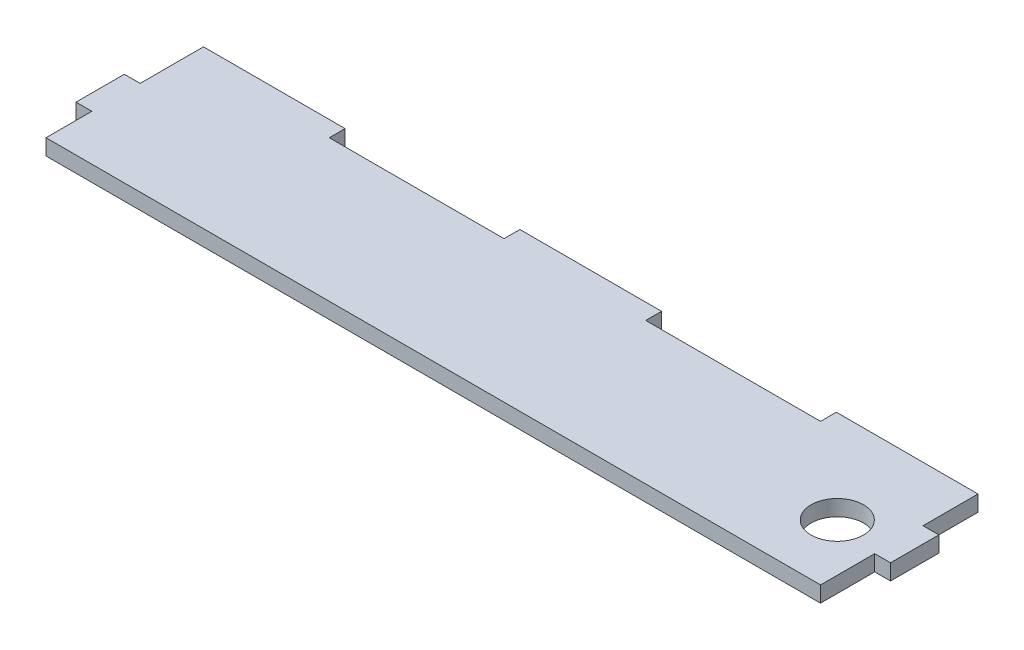
ISO-10303-21;
HEADER;
FILE_DESCRIPTION(('STEP AP214'),'2;1');
FILE_NAME('part.step','',(''),(''),'','','');
FILE_SCHEMA(('AUTOMOTIVE_DESIGN { 1 0 10303 214 1 1 1 1 }'));
ENDSEC;
DATA;
#1=APPLICATION_CONTEXT('core data for automotive mechanical design processes');
#2=APPLICATION_PROTOCOL_DEFINITION('international standard','automotive_design',2000,#1);
#3=PRODUCT_CONTEXT('',#1,'mechanical');
#4=PRODUCT('Part','Part','',(#3));
#5=PRODUCT_RELATED_PRODUCT_CATEGORY('part','',(#4));
#6=PRODUCT_DEFINITION_FORMATION('','',#4);
#7=PRODUCT_DEFINITION_CONTEXT('part definition',#1,'design');
#8=PRODUCT_DEFINITION('design','',#6,#7);
#9=PRODUCT_DEFINITION_SHAPE('','',#8);
#10=(LENGTH_UNIT() NAMED_UNIT(*) SI_UNIT(.MILLI.,.METRE.));
#11=(NAMED_UNIT(*) PLANE_ANGLE_UNIT() SI_UNIT($,.RADIAN.));
#12=(NAMED_UNIT(*) SI_UNIT($,.STERADIAN.) SOLID_ANGLE_UNIT());
#13=UNCERTAINTY_MEASURE_WITH_UNIT(LENGTH_MEASURE(1.E-05),#10,'distance_accuracy_value','');
#14=(GEOMETRIC_REPRESENTATION_CONTEXT(3) GLOBAL_UNCERTAINTY_ASSIGNED_CONTEXT((#13)) GLOBAL_UNIT_ASSIGNED_CONTEXT((#10,
#11,#12)) REPRESENTATION_CONTEXT('',''));
#15=CARTESIAN_POINT('',(0.,0.,0.));
#16=DIRECTION('',(0.,0.,1.));
#17=DIRECTION('',(1.,0.,0.));
#18=AXIS2_PLACEMENT_3D('',#15,#16,#17);
#19=CARTESIAN_POINT('',(-948.418408841076,3374.03154429096,189.));
#20=DIRECTION('',(-1.,0.,0.));
#21=DIRECTION('',(0.,-1.,0.));
#22=AXIS2_PLACEMENT_3D('',#19,#20,#21);
#23=PLANE('',#22);
#24=CARTESIAN_POINT('',(-948.418408841076,3355.03154429096,66.));
#25=CARTESIAN_POINT('',(-948.418408841076,3374.03154429096,66.));
#26=B_SPLINE_CURVE_WITH_KNOTS('',1,(#24,#25),.UNSPECIFIED.,.F.,.F.,(2,2),(0.,0.123376623376624),.UNSPECIFIED.);
#27=CARTESIAN_POINT('',(-948.418408841076,3355.03154429096,66.));
#28=VERTEX_POINT('',#27);
#29=CARTESIAN_POINT('',(-948.418408841076,3374.03154429096,66.));
#30=VERTEX_POINT('',#29);
#31=EDGE_CURVE('E189',#28,#30,#26,.T.);
#32=ORIENTED_EDGE('',*,*,#31,.F.);
#33=DIRECTION('',(0.,0.,-1.));
#34=VECTOR('',#33,1.);
#35=CARTESIAN_POINT('',(-948.418408841076,3355.03154429096,189.));
#36=LINE('',#35,#34);
#37=CARTESIAN_POINT('',(-948.418408841076,3355.03154429096,0.));
#38=VERTEX_POINT('',#37);
#39=EDGE_CURVE('E174',#28,#38,#36,.T.);
#40=ORIENTED_EDGE('',*,*,#39,.T.);
#41=DIRECTION('',(0.,-1.,0.));
#42=VECTOR('',#41,1.);
#43=CARTESIAN_POINT('',(-948.418408841076,3374.03154429096,0.));
#44=LINE('',#43,#42);
#45=CARTESIAN_POINT('',(-948.418408841076,3374.03154429096,0.));
#46=VERTEX_POINT('',#45);
#47=EDGE_CURVE('E217',#46,#38,#44,.T.);
#48=ORIENTED_EDGE('',*,*,#47,.F.);
#49=DIRECTION('',(0.,0.,-1.));
#50=VECTOR('',#49,1.);
#51=CARTESIAN_POINT('',(-948.418408841076,3374.03154429096,189.));
#52=LINE('',#51,#50);
#53=EDGE_CURVE('E47',#30,#46,#52,.T.);
#54=ORIENTED_EDGE('',*,*,#53,.F.);
#55=EDGE_LOOP('',(#32,#40,#48,#54));
#56=FACE_BOUND('',#55,.T.);
#57=ADVANCED_FACE('F32',(#56),#23,.F.);
#58=CARTESIAN_POINT('',(-948.418408841076,3374.03154429096,124.));
#59=CARTESIAN_POINT('',(-948.418408841076,3355.03154429096,124.));
#60=B_SPLINE_CURVE_WITH_KNOTS('',1,(#58,#59),.UNSPECIFIED.,.F.,.F.,(2,2),(0.5,
0.623376623376624),.UNSPECIFIED.);
#61=CARTESIAN_POINT('',(-948.418408841076,3374.03154429096,124.));
#62=VERTEX_POINT('',#61);
#63=CARTESIAN_POINT('',(-948.418408841076,3355.03154429096,124.));
#64=VERTEX_POINT('',#63);
#65=EDGE_CURVE('E55',#62,#64,#60,.T.);
#66=ORIENTED_EDGE('',*,*,#65,.F.);
#67=CARTESIAN_POINT('',(-948.418408841076,3374.03154429096,189.));
#68=VERTEX_POINT('',#67);
#69=EDGE_CURVE('E354',#68,#62,#52,.T.);
#70=ORIENTED_EDGE('',*,*,#69,.F.);
#71=DIRECTION('',(0.,1.,0.));
#72=VECTOR('',#71,1.);
#73=CARTESIAN_POINT('',(-948.418408841076,3374.03154429096,189.));
#74=LINE('',#73,#72);
#75=CARTESIAN_POINT('',(-948.418408841076,3355.03154429096,189.));
#76=VERTEX_POINT('',#75);
#77=EDGE_CURVE('E172',#76,#68,#74,.T.);
#78=ORIENTED_EDGE('',*,*,#77,.F.);
#79=EDGE_CURVE('E169',#76,#64,#36,.T.);
#80=ORIENTED_EDGE('',*,*,#79,.T.);
#81=EDGE_LOOP('',(#66,#70,#78,#80));
#82=FACE_BOUND('',#81,.T.);
#83=ADVANCED_FACE('F171',(#82),#23,.F.);
#84=CARTESIAN_POINT('',(0.,0.,19.));
#85=DIRECTION('',(0.,0.,1.));
#86=DIRECTION('',(1.,0.,0.));
#87=AXIS2_PLACEMENT_3D('',#84,#85,#86);
#88=PLANE('',#87);
#89=CARTESIAN_POINT('',(-1118.41840884108,3355.03154429096,19.));
#90=CARTESIAN_POINT('',(-1118.41840884108,3374.03154429096,19.));
#91=B_SPLINE_CURVE_WITH_KNOTS('',1,(#89,#90),.UNSPECIFIED.,.F.,.F.,(2,2),(0.,
0.0502645502645506),.UNSPECIFIED.);
#92=CARTESIAN_POINT('',(-1118.41840884108,3355.03154429096,19.));
#93=VERTEX_POINT('',#92);
#94=CARTESIAN_POINT('',(-1118.41840884108,3374.03154429096,19.));
#95=VERTEX_POINT('',#94);
#96=EDGE_CURVE('E210',#93,#95,#91,.T.);
#97=ORIENTED_EDGE('',*,*,#96,.F.);
#98=DIRECTION('',(1.,0.,0.));
#99=VECTOR('',#98,1.);
#100=CARTESIAN_POINT('',(-1878.01840884108,3355.03154429096,19.));
#101=LINE('',#100,#99);
#102=CARTESIAN_POINT('',(-1328.21840884108,3355.03154429096,19.));
#103=VERTEX_POINT('',#102);
#104=EDGE_CURVE('E335',#103,#93,#101,.T.);
#105=ORIENTED_EDGE('',*,*,#104,.F.);
#106=CARTESIAN_POINT('',(-1328.21840884108,3374.03154429096,19.));
#107=CARTESIAN_POINT('',(-1328.21840884108,3355.03154429096,19.));
#108=B_SPLINE_CURVE_WITH_KNOTS('',1,(#106,#107),.UNSPECIFIED.,.F.,.F.,(2,2),(0.5,
0.550264550264551),.UNSPECIFIED.);
#109=CARTESIAN_POINT('',(-1328.21840884108,3374.03154429096,19.));
#110=VERTEX_POINT('',#109);
#111=EDGE_CURVE('E238',#110,#103,#108,.T.);
#112=ORIENTED_EDGE('',*,*,#111,.F.);
#113=DIRECTION('',(-1.,0.,0.));
#114=VECTOR('',#113,1.);
#115=CARTESIAN_POINT('',(-1878.01840884108,3374.03154429096,19.));
#116=LINE('',#115,#114);
#117=EDGE_CURVE('E340',#95,#110,#116,.T.);
#118=ORIENTED_EDGE('',*,*,#117,.F.);
#119=EDGE_LOOP('',(#97,#105,#112,#118));
#120=FACE_BOUND('',#119,.T.);
#121=ADVANCED_FACE('F371',(#120),#88,.F.);
#122=CARTESIAN_POINT('',(-1498.21840884108,3355.03154429096,19.));
#123=CARTESIAN_POINT('',(-1498.21840884108,3374.03154429096,19.));
#124=B_SPLINE_CURVE_WITH_KNOTS('',1,(#122,#123),.UNSPECIFIED.,.F.,.F.,(2,2),(0.,
0.0502645502645506),.UNSPECIFIED.);
#125=CARTESIAN_POINT('',(-1498.21840884108,3355.03154429096,19.));
#126=VERTEX_POINT('',#125);
#127=CARTESIAN_POINT('',(-1498.21840884108,3374.03154429096,19.));
#128=VERTEX_POINT('',#127);
#129=EDGE_CURVE('E245',#126,#128,#124,.T.);
#130=ORIENTED_EDGE('',*,*,#129,.F.);
#131=CARTESIAN_POINT('',(-1708.01840884108,3355.03154429096,19.));
#132=VERTEX_POINT('',#131);
#133=EDGE_CURVE('E346',#132,#126,#101,.T.);
#134=ORIENTED_EDGE('',*,*,#133,.F.);
#135=CARTESIAN_POINT('',(-1708.01840884108,3374.03154429096,19.));
#136=CARTESIAN_POINT('',(-1708.01840884108,3355.03154429096,19.));
#137=B_SPLINE_CURVE_WITH_KNOTS('',1,(#135,#136),.UNSPECIFIED.,.F.,.F.,(2,2),(0.5,
0.550264550264551),.UNSPECIFIED.);
#138=CARTESIAN_POINT('',(-1708.01840884108,3374.03154429096,19.));
#139=VERTEX_POINT('',#138);
#140=EDGE_CURVE('E278',#139,#132,#137,.T.);
#141=ORIENTED_EDGE('',*,*,#140,.F.);
#142=EDGE_CURVE('E349',#128,#139,#116,.T.);
#143=ORIENTED_EDGE('',*,*,#142,.F.);
#144=EDGE_LOOP('',(#130,#134,#141,#143));
#145=FACE_BOUND('',#144,.T.);
#146=ADVANCED_FACE('F383',(#145),#88,.F.);
#147=CARTESIAN_POINT('',(-1878.01840884108,3374.03154429096,189.));
#148=DIRECTION('',(1.,0.,0.));
#149=DIRECTION('',(0.,0.,-1.));
#150=AXIS2_PLACEMENT_3D('',#147,#148,#149);
#151=PLANE('',#150);
#152=DIRECTION('',(0.,0.,-1.));
#153=VECTOR('',#152,1.);
#154=CARTESIAN_POINT('',(-1878.01840884108,3355.03154429096,189.));
#155=LINE('',#154,#153);
#156=CARTESIAN_POINT('',(-1878.01840884108,3355.03154429096,76.));
#157=VERTEX_POINT('',#156);
#158=CARTESIAN_POINT('',(-1878.01840884108,3355.03154429096,0.));
#159=VERTEX_POINT('',#158);
#160=EDGE_CURVE('E40',#157,#159,#155,.T.);
#161=ORIENTED_EDGE('',*,*,#160,.F.);
#162=CARTESIAN_POINT('',(-1878.01840884108,3355.03154429096,76.));
#163=CARTESIAN_POINT('',(-1878.01840884108,3374.03154429096,76.));
#164=B_SPLINE_CURVE_WITH_KNOTS('',1,(#162,#163),.UNSPECIFIED.,.F.,.F.,(2,2),(0.,
0.123376623376624),.UNSPECIFIED.);
#165=CARTESIAN_POINT('',(-1878.01840884108,3374.03154429096,76.));
#166=VERTEX_POINT('',#165);
#167=EDGE_CURVE('E290',#157,#166,#164,.T.);
#168=ORIENTED_EDGE('',*,*,#167,.T.);
#169=DIRECTION('',(0.,0.,-1.));
#170=VECTOR('',#169,1.);
#171=CARTESIAN_POINT('',(-1878.01840884108,3374.03154429096,189.));
#172=LINE('',#171,#170);
#173=CARTESIAN_POINT('',(-1878.01840884108,3374.03154429096,0.));
#174=VERTEX_POINT('',#173);
#175=EDGE_CURVE('E345',#166,#174,#172,.T.);
#176=ORIENTED_EDGE('',*,*,#175,.T.);
#177=DIRECTION('',(0.,1.,0.));
#178=VECTOR('',#177,1.);
#179=CARTESIAN_POINT('',(-1878.01840884108,3355.03154429096,0.));
#180=LINE('',#179,#178);
#181=EDGE_CURVE('E294',#159,#174,#180,.T.);
#182=ORIENTED_EDGE('',*,*,#181,.F.);
#183=EDGE_LOOP('',(#161,#168,#176,#182));
#184=FACE_BOUND('',#183,.T.);
#185=ADVANCED_FACE('F396',(#184),#151,.F.);
#186=CARTESIAN_POINT('',(-1878.01840884108,3374.03154429096,189.));
#187=VERTEX_POINT('',#186);
#188=CARTESIAN_POINT('',(-1878.01840884108,3374.03154429096,134.));
#189=VERTEX_POINT('',#188);
#190=EDGE_CURVE('E351',#187,#189,#172,.T.);
#191=ORIENTED_EDGE('',*,*,#190,.T.);
#192=CARTESIAN_POINT('',(-1878.01840884108,3374.03154429096,134.));
#193=CARTESIAN_POINT('',(-1878.01840884108,3355.03154429096,134.));
#194=B_SPLINE_CURVE_WITH_KNOTS('',1,(#192,#193),.UNSPECIFIED.,.F.,.F.,(2,2),(0.5,
0.623376623376624),.UNSPECIFIED.);
#195=CARTESIAN_POINT('',(-1878.01840884108,3355.03154429096,134.));
#196=VERTEX_POINT('',#195);
#197=EDGE_CURVE('E316',#189,#196,#194,.T.);
#198=ORIENTED_EDGE('',*,*,#197,.T.);
#199=CARTESIAN_POINT('',(-1878.01840884108,3355.03154429096,189.));
#200=VERTEX_POINT('',#199);
#201=EDGE_CURVE('E11',#200,#196,#155,.T.);
#202=ORIENTED_EDGE('',*,*,#201,.F.);
#203=DIRECTION('',(0.,-1.,0.));
#204=VECTOR('',#203,1.);
#205=CARTESIAN_POINT('',(-1878.01840884108,3374.03154429096,189.));
#206=LINE('',#205,#204);
#207=EDGE_CURVE('E336',#187,#200,#206,.T.);
#208=ORIENTED_EDGE('',*,*,#207,.F.);
#209=EDGE_LOOP('',(#191,#198,#202,#208));
#210=FACE_BOUND('',#209,.T.);
#211=ADVANCED_FACE('F34',(#210),#151,.F.);
#212=CARTESIAN_POINT('',(-1878.01840884108,3355.03154429096,189.));
#213=DIRECTION('',(0.,1.,0.));
#214=DIRECTION('',(0.,0.,1.));
#215=AXIS2_PLACEMENT_3D('',#212,#213,#214);
#216=PLANE('',#215);
#217=CARTESIAN_POINT('',(-1005.92382658818,3355.03154429096,111.37088114683));
#218=DIRECTION('',(0.,1.,0.));
#219=DIRECTION('',(0.,0.,1.));
#220=AXIS2_PLACEMENT_3D('',#217,#218,#219);
#221=CIRCLE('',#220,31.4746452947954);
#222=CARTESIAN_POINT('',(-1005.92382658818,3355.03154429096,142.845526441626));
#223=VERTEX_POINT('',#222);
#224=EDGE_CURVE('E194',#223,#223,#221,.T.);
#225=ORIENTED_EDGE('',*,*,#224,.T.);
#226=EDGE_LOOP('',(#225));
#227=FACE_BOUND('',#226,.T.);
#228=ORIENTED_EDGE('',*,*,#160,.T.);
#229=DIRECTION('',(-1.,0.,0.));
#230=VECTOR('',#229,1.);
#231=CARTESIAN_POINT('',(-1708.01840884108,3355.03154429096,0.));
#232=LINE('',#231,#230);
#233=CARTESIAN_POINT('',(-1708.01840884108,3355.03154429096,0.));
#234=VERTEX_POINT('',#233);
#235=EDGE_CURVE('E297',#234,#159,#232,.T.);
#236=ORIENTED_EDGE('',*,*,#235,.F.);
#237=DIRECTION('',(0.,0.,1.));
#238=VECTOR('',#237,1.);
#239=CARTESIAN_POINT('',(-1708.01840884108,3355.03154429096,-19.));
#240=LINE('',#239,#238);
#241=EDGE_CURVE('E283',#234,#132,#240,.T.);
#242=ORIENTED_EDGE('',*,*,#241,.T.);
#243=ORIENTED_EDGE('',*,*,#133,.T.);
#244=DIRECTION('',(0.,0.,1.));
#245=VECTOR('',#244,1.);
#246=CARTESIAN_POINT('',(-1498.21840884108,3355.03154429096,-19.));
#247=LINE('',#246,#245);
#248=CARTESIAN_POINT('',(-1498.21840884108,3355.03154429096,0.));
#249=VERTEX_POINT('',#248);
#250=EDGE_CURVE('E223',#249,#126,#247,.T.);
#251=ORIENTED_EDGE('',*,*,#250,.F.);
#252=DIRECTION('',(-1.,0.,0.));
#253=VECTOR('',#252,1.);
#254=CARTESIAN_POINT('',(-1328.21840884108,3355.03154429096,0.));
#255=LINE('',#254,#253);
#256=CARTESIAN_POINT('',(-1328.21840884108,3355.03154429096,0.));
#257=VERTEX_POINT('',#256);
#258=EDGE_CURVE('E267',#257,#249,#255,.T.);
#259=ORIENTED_EDGE('',*,*,#258,.F.);
#260=DIRECTION('',(0.,0.,1.));
#261=VECTOR('',#260,1.);
#262=CARTESIAN_POINT('',(-1328.21840884108,3355.03154429096,-19.));
#263=LINE('',#262,#261);
#264=EDGE_CURVE('E243',#257,#103,#263,.T.);
#265=ORIENTED_EDGE('',*,*,#264,.T.);
#266=ORIENTED_EDGE('',*,*,#104,.T.);
#267=DIRECTION('',(0.,0.,1.));
#268=VECTOR('',#267,1.);
#269=CARTESIAN_POINT('',(-1118.41840884108,3355.03154429096,-19.));
#270=LINE('',#269,#268);
#271=CARTESIAN_POINT('',(-1118.41840884108,3355.03154429096,0.));
#272=VERTEX_POINT('',#271);
#273=EDGE_CURVE('E216',#272,#93,#270,.T.);
#274=ORIENTED_EDGE('',*,*,#273,.F.);
#275=DIRECTION('',(-1.,0.,0.));
#276=VECTOR('',#275,1.);
#277=CARTESIAN_POINT('',(-948.418408841076,3355.03154429096,0.));
#278=LINE('',#277,#276);
#279=EDGE_CURVE('E230',#38,#272,#278,.T.);
#280=ORIENTED_EDGE('',*,*,#279,.F.);
#281=ORIENTED_EDGE('',*,*,#39,.F.);
#282=DIRECTION('',(-1.,0.,0.));
#283=VECTOR('',#282,1.);
#284=CARTESIAN_POINT('',(-910.418408841076,3355.03154429096,66.));
#285=LINE('',#284,#283);
#286=CARTESIAN_POINT('',(-929.418408841076,3355.03154429096,66.));
#287=VERTEX_POINT('',#286);
#288=EDGE_CURVE('E184',#287,#28,#285,.T.);
#289=ORIENTED_EDGE('',*,*,#288,.F.);
#290=DIRECTION('',(0.,0.,1.));
#291=VECTOR('',#290,1.);
#292=CARTESIAN_POINT('',(-929.418408841076,3355.03154429096,124.));
#293=LINE('',#292,#291);
#294=CARTESIAN_POINT('',(-929.418408841076,3355.03154429096,124.));
#295=VERTEX_POINT('',#294);
#296=EDGE_CURVE('E180',#287,#295,#293,.T.);
#297=ORIENTED_EDGE('',*,*,#296,.T.);
#298=DIRECTION('',(-1.,0.,0.));
#299=VECTOR('',#298,1.);
#300=CARTESIAN_POINT('',(-910.418408841076,3355.03154429096,124.));
#301=LINE('',#300,#299);
#302=EDGE_CURVE('E177',#295,#64,#301,.T.);
#303=ORIENTED_EDGE('',*,*,#302,.T.);
#304=ORIENTED_EDGE('',*,*,#79,.F.);
#305=DIRECTION('',(1.,0.,0.));
#306=VECTOR('',#305,1.);
#307=CARTESIAN_POINT('',(-1878.01840884108,3355.03154429096,189.));
#308=LINE('',#307,#306);
#309=EDGE_CURVE('E339',#200,#76,#308,.T.);
#310=ORIENTED_EDGE('',*,*,#309,.F.);
#311=ORIENTED_EDGE('',*,*,#201,.T.);
#312=DIRECTION('',(1.,0.,0.));
#313=VECTOR('',#312,1.);
#314=CARTESIAN_POINT('',(-1916.01840884108,3355.03154429096,134.));
#315=LINE('',#314,#313);
#316=CARTESIAN_POINT('',(-1897.01840884108,3355.03154429096,134.));
#317=VERTEX_POINT('',#316);
#318=EDGE_CURVE('E329',#317,#196,#315,.T.);
#319=ORIENTED_EDGE('',*,*,#318,.F.);
#320=DIRECTION('',(0.,0.,1.));
#321=VECTOR('',#320,1.);
#322=CARTESIAN_POINT('',(-1897.01840884108,3355.03154429096,134.));
#323=LINE('',#322,#321);
#324=CARTESIAN_POINT('',(-1897.01840884108,3355.03154429096,76.));
#325=VERTEX_POINT('',#324);
#326=EDGE_CURVE('E306',#325,#317,#323,.T.);
#327=ORIENTED_EDGE('',*,*,#326,.F.);
#328=DIRECTION('',(1.,0.,0.));
#329=VECTOR('',#328,1.);
#330=CARTESIAN_POINT('',(-1916.01840884108,3355.03154429096,76.));
#331=LINE('',#330,#329);
#332=EDGE_CURVE('E307',#325,#157,#331,.T.);
#333=ORIENTED_EDGE('',*,*,#332,.T.);
#334=EDGE_LOOP('',(#228,#236,#242,#243,#251,#259,#265,#266,#274,#280,#281,#289,#297,#303,#304,
#310,#311,#319,#327,#333));
#335=FACE_BOUND('',#334,.T.);
#336=ADVANCED_FACE('F178',(#227,#335),#216,.F.);
#337=CARTESIAN_POINT('',(-1878.01840884108,3374.03154429096,189.));
#338=DIRECTION('',(0.,-1.,0.));
#339=DIRECTION('',(0.,0.,-1.));
#340=AXIS2_PLACEMENT_3D('',#337,#338,#339);
#341=PLANE('',#340);
#342=CARTESIAN_POINT('',(-1005.92382658818,3374.03154429096,111.37088114683));
#343=DIRECTION('',(0.,1.,0.));
#344=DIRECTION('',(0.,0.,1.));
#345=AXIS2_PLACEMENT_3D('',#342,#343,#344);
#346=CIRCLE('',#345,31.4746452947954);
#347=CARTESIAN_POINT('',(-1005.92382658818,3374.03154429096,142.845526441626));
#348=VERTEX_POINT('',#347);
#349=EDGE_CURVE('E447',#348,#348,#346,.T.);
#350=ORIENTED_EDGE('',*,*,#349,.F.);
#351=EDGE_LOOP('',(#350));
#352=FACE_BOUND('',#351,.T.);
#353=ORIENTED_EDGE('',*,*,#69,.T.);
#354=DIRECTION('',(-1.,0.,0.));
#355=VECTOR('',#354,1.);
#356=CARTESIAN_POINT('',(-910.418408841076,3374.03154429096,124.));
#357=LINE('',#356,#355);
#358=CARTESIAN_POINT('',(-929.418408841076,3374.03154429096,124.));
#359=VERTEX_POINT('',#358);
#360=EDGE_CURVE('E183',#359,#62,#357,.T.);
#361=ORIENTED_EDGE('',*,*,#360,.F.);
#362=DIRECTION('',(0.,0.,-1.));
#363=VECTOR('',#362,1.);
#364=CARTESIAN_POINT('',(-929.418408841076,3374.03154429096,66.));
#365=LINE('',#364,#363);
#366=CARTESIAN_POINT('',(-929.418408841076,3374.03154429096,66.));
#367=VERTEX_POINT('',#366);
#368=EDGE_CURVE('E453',#359,#367,#365,.T.);
#369=ORIENTED_EDGE('',*,*,#368,.T.);
#370=DIRECTION('',(-1.,0.,0.));
#371=VECTOR('',#370,1.);
#372=CARTESIAN_POINT('',(-910.418408841076,3374.03154429096,66.));
#373=LINE('',#372,#371);
#374=EDGE_CURVE('E206',#367,#30,#373,.T.);
#375=ORIENTED_EDGE('',*,*,#374,.T.);
#376=ORIENTED_EDGE('',*,*,#53,.T.);
#377=DIRECTION('',(1.,0.,0.));
#378=VECTOR('',#377,1.);
#379=CARTESIAN_POINT('',(-1118.41840884108,3374.03154429096,0.));
#380=LINE('',#379,#378);
#381=CARTESIAN_POINT('',(-1118.41840884108,3374.03154429096,0.));
#382=VERTEX_POINT('',#381);
#383=EDGE_CURVE('E224',#382,#46,#380,.T.);
#384=ORIENTED_EDGE('',*,*,#383,.F.);
#385=DIRECTION('',(0.,0.,1.));
#386=VECTOR('',#385,1.);
#387=CARTESIAN_POINT('',(-1118.41840884108,3374.03154429096,-19.));
#388=LINE('',#387,#386);
#389=EDGE_CURVE('E215',#382,#95,#388,.T.);
#390=ORIENTED_EDGE('',*,*,#389,.T.);
#391=ORIENTED_EDGE('',*,*,#117,.T.);
#392=DIRECTION('',(0.,0.,1.));
#393=VECTOR('',#392,1.);
#394=CARTESIAN_POINT('',(-1328.21840884108,3374.03154429096,-19.));
#395=LINE('',#394,#393);
#396=CARTESIAN_POINT('',(-1328.21840884108,3374.03154429096,0.));
#397=VERTEX_POINT('',#396);
#398=EDGE_CURVE('E244',#397,#110,#395,.T.);
#399=ORIENTED_EDGE('',*,*,#398,.F.);
#400=DIRECTION('',(1.,0.,0.));
#401=VECTOR('',#400,1.);
#402=CARTESIAN_POINT('',(-1498.21840884108,3374.03154429096,0.));
#403=LINE('',#402,#401);
#404=CARTESIAN_POINT('',(-1498.21840884108,3374.03154429096,0.));
#405=VERTEX_POINT('',#404);
#406=EDGE_CURVE('E261',#405,#397,#403,.T.);
#407=ORIENTED_EDGE('',*,*,#406,.F.);
#408=DIRECTION('',(0.,0.,1.));
#409=VECTOR('',#408,1.);
#410=CARTESIAN_POINT('',(-1498.21840884108,3374.03154429096,-19.));
#411=LINE('',#410,#409);
#412=EDGE_CURVE('E253',#405,#128,#411,.T.);
#413=ORIENTED_EDGE('',*,*,#412,.T.);
#414=ORIENTED_EDGE('',*,*,#142,.T.);
#415=DIRECTION('',(0.,0.,1.));
#416=VECTOR('',#415,1.);
#417=CARTESIAN_POINT('',(-1708.01840884108,3374.03154429096,-19.));
#418=LINE('',#417,#416);
#419=CARTESIAN_POINT('',(-1708.01840884108,3374.03154429096,0.));
#420=VERTEX_POINT('',#419);
#421=EDGE_CURVE('E260',#420,#139,#418,.T.);
#422=ORIENTED_EDGE('',*,*,#421,.F.);
#423=DIRECTION('',(1.,0.,0.));
#424=VECTOR('',#423,1.);
#425=CARTESIAN_POINT('',(-1878.01840884108,3374.03154429096,0.));
#426=LINE('',#425,#424);
#427=EDGE_CURVE('E291',#174,#420,#426,.T.);
#428=ORIENTED_EDGE('',*,*,#427,.F.);
#429=ORIENTED_EDGE('',*,*,#175,.F.);
#430=DIRECTION('',(1.,0.,0.));
#431=VECTOR('',#430,1.);
#432=CARTESIAN_POINT('',(-1916.01840884108,3374.03154429096,76.));
#433=LINE('',#432,#431);
#434=CARTESIAN_POINT('',(-1897.01840884108,3374.03154429096,76.));
#435=VERTEX_POINT('',#434);
#436=EDGE_CURVE('E324',#435,#166,#433,.T.);
#437=ORIENTED_EDGE('',*,*,#436,.F.);
#438=DIRECTION('',(0.,0.,-1.));
#439=VECTOR('',#438,1.);
#440=CARTESIAN_POINT('',(-1897.01840884108,3374.03154429096,76.));
#441=LINE('',#440,#439);
#442=CARTESIAN_POINT('',(-1897.01840884108,3374.03154429096,134.));
#443=VERTEX_POINT('',#442);
#444=EDGE_CURVE('E311',#443,#435,#441,.T.);
#445=ORIENTED_EDGE('',*,*,#444,.F.);
#446=DIRECTION('',(1.,0.,0.));
#447=VECTOR('',#446,1.);
#448=CARTESIAN_POINT('',(-1916.01840884108,3374.03154429096,134.));
#449=LINE('',#448,#447);
#450=EDGE_CURVE('E331',#443,#189,#449,.T.);
#451=ORIENTED_EDGE('',*,*,#450,.T.);
#452=ORIENTED_EDGE('',*,*,#190,.F.);
#453=DIRECTION('',(-1.,0.,0.));
#454=VECTOR('',#453,1.);
#455=CARTESIAN_POINT('',(-1878.01840884108,3374.03154429096,189.));
#456=LINE('',#455,#454);
#457=EDGE_CURVE('E343',#68,#187,#456,.T.);
#458=ORIENTED_EDGE('',*,*,#457,.F.);
#459=EDGE_LOOP('',(#353,#361,#369,#375,#376,#384,#390,#391,#399,#407,#413,#414,#422,#428,#429,
#437,#445,#451,#452,#458));
#460=FACE_BOUND('',#459,.T.);
#461=ADVANCED_FACE('F357',(#352,#460),#341,.F.);
#462=CARTESIAN_POINT('',(0.,0.,189.));
#463=DIRECTION('',(0.,0.,1.));
#464=DIRECTION('',(1.,0.,0.));
#465=AXIS2_PLACEMENT_3D('',#462,#463,#464);
#466=PLANE('',#465);
#467=ORIENTED_EDGE('',*,*,#207,.T.);
#468=ORIENTED_EDGE('',*,*,#309,.T.);
#469=ORIENTED_EDGE('',*,*,#77,.T.);
#470=ORIENTED_EDGE('',*,*,#457,.T.);
#471=EDGE_LOOP('',(#467,#468,#469,#470));
#472=FACE_BOUND('',#471,.T.);
#473=ADVANCED_FACE('F418',(#472),#466,.T.);
#474=CARTESIAN_POINT('',(-1916.01840884108,3355.03154429096,76.));
#475=DIRECTION('',(0.,0.,-1.));
#476=DIRECTION('',(-1.,0.,0.));
#477=AXIS2_PLACEMENT_3D('',#474,#475,#476);
#478=PLANE('',#477);
#479=DIRECTION('',(0.,-1.,0.));
#480=VECTOR('',#479,1.);
#481=CARTESIAN_POINT('',(-1897.01840884108,3355.03154429096,76.));
#482=LINE('',#481,#480);
#483=EDGE_CURVE('E309',#435,#325,#482,.T.);
#484=ORIENTED_EDGE('',*,*,#483,.F.);
#485=ORIENTED_EDGE('',*,*,#436,.T.);
#486=ORIENTED_EDGE('',*,*,#167,.F.);
#487=ORIENTED_EDGE('',*,*,#332,.F.);
#488=EDGE_LOOP('',(#484,#485,#486,#487));
#489=FACE_BOUND('',#488,.T.);
#490=ADVANCED_FACE('F402',(#489),#478,.T.);
#491=CARTESIAN_POINT('',(-1916.01840884108,3374.03154429096,134.));
#492=DIRECTION('',(0.,0.,1.));
#493=DIRECTION('',(1.,0.,0.));
#494=AXIS2_PLACEMENT_3D('',#491,#492,#493);
#495=PLANE('',#494);
#496=DIRECTION('',(0.,1.,0.));
#497=VECTOR('',#496,1.);
#498=CARTESIAN_POINT('',(-1897.01840884108,3374.03154429096,134.));
#499=LINE('',#498,#497);
#500=EDGE_CURVE('E304',#317,#443,#499,.T.);
#501=ORIENTED_EDGE('',*,*,#500,.F.);
#502=ORIENTED_EDGE('',*,*,#318,.T.);
#503=ORIENTED_EDGE('',*,*,#197,.F.);
#504=ORIENTED_EDGE('',*,*,#450,.F.);
#505=EDGE_LOOP('',(#501,#502,#503,#504));
#506=FACE_BOUND('',#505,.T.);
#507=ADVANCED_FACE('F412',(#506),#495,.T.);
#508=CARTESIAN_POINT('',(-1897.01840884108,3374.03154429096,189.));
#509=DIRECTION('',(1.,0.,0.));
#510=DIRECTION('',(0.,0.,-1.));
#511=AXIS2_PLACEMENT_3D('',#508,#509,#510);
#512=PLANE('',#511);
#513=ORIENTED_EDGE('',*,*,#483,.T.);
#514=ORIENTED_EDGE('',*,*,#326,.T.);
#515=ORIENTED_EDGE('',*,*,#500,.T.);
#516=ORIENTED_EDGE('',*,*,#444,.T.);
#517=EDGE_LOOP('',(#513,#514,#515,#516));
#518=FACE_BOUND('',#517,.T.);
#519=ADVANCED_FACE('F406',(#518),#512,.F.);
#520=CARTESIAN_POINT('',(-1708.01840884108,3374.03154429096,-19.));
#521=DIRECTION('',(-1.,0.,0.));
#522=DIRECTION('',(0.,0.,1.));
#523=AXIS2_PLACEMENT_3D('',#520,#521,#522);
#524=PLANE('',#523);
#525=DIRECTION('',(0.,-1.,0.));
#526=VECTOR('',#525,1.);
#527=CARTESIAN_POINT('',(-1708.01840884108,3374.03154429096,0.));
#528=LINE('',#527,#526);
#529=EDGE_CURVE('E284',#420,#234,#528,.T.);
#530=ORIENTED_EDGE('',*,*,#529,.F.);
#531=ORIENTED_EDGE('',*,*,#421,.T.);
#532=ORIENTED_EDGE('',*,*,#140,.T.);
#533=ORIENTED_EDGE('',*,*,#241,.F.);
#534=EDGE_LOOP('',(#530,#531,#532,#533));
#535=FACE_BOUND('',#534,.T.);
#536=ADVANCED_FACE('F387',(#535),#524,.F.);
#537=CARTESIAN_POINT('',(0.,0.,0.));
#538=DIRECTION('',(0.,0.,-1.));
#539=DIRECTION('',(-1.,0.,0.));
#540=AXIS2_PLACEMENT_3D('',#537,#538,#539);
#541=PLANE('',#540);
#542=ORIENTED_EDGE('',*,*,#235,.T.);
#543=ORIENTED_EDGE('',*,*,#181,.T.);
#544=ORIENTED_EDGE('',*,*,#427,.T.);
#545=ORIENTED_EDGE('',*,*,#529,.T.);
#546=EDGE_LOOP('',(#542,#543,#544,#545));
#547=FACE_BOUND('',#546,.T.);
#548=ADVANCED_FACE('F392',(#547),#541,.T.);
#549=CARTESIAN_POINT('',(-1498.21840884108,3355.03154429096,-19.));
#550=DIRECTION('',(1.,0.,0.));
#551=DIRECTION('',(0.,0.,-1.));
#552=AXIS2_PLACEMENT_3D('',#549,#550,#551);
#553=PLANE('',#552);
#554=DIRECTION('',(0.,1.,0.));
#555=VECTOR('',#554,1.);
#556=CARTESIAN_POINT('',(-1498.21840884108,3355.03154429096,0.));
#557=LINE('',#556,#555);
#558=EDGE_CURVE('E264',#249,#405,#557,.T.);
#559=ORIENTED_EDGE('',*,*,#558,.F.);
#560=ORIENTED_EDGE('',*,*,#250,.T.);
#561=ORIENTED_EDGE('',*,*,#129,.T.);
#562=ORIENTED_EDGE('',*,*,#412,.F.);
#563=EDGE_LOOP('',(#559,#560,#561,#562));
#564=FACE_BOUND('',#563,.T.);
#565=ADVANCED_FACE('F381',(#564),#553,.F.);
#566=CARTESIAN_POINT('',(-1328.21840884108,3374.03154429096,-19.));
#567=DIRECTION('',(-1.,0.,0.));
#568=DIRECTION('',(0.,0.,1.));
#569=AXIS2_PLACEMENT_3D('',#566,#567,#568);
#570=PLANE('',#569);
#571=DIRECTION('',(0.,-1.,0.));
#572=VECTOR('',#571,1.);
#573=CARTESIAN_POINT('',(-1328.21840884108,3374.03154429096,0.));
#574=LINE('',#573,#572);
#575=EDGE_CURVE('E254',#397,#257,#574,.T.);
#576=ORIENTED_EDGE('',*,*,#575,.F.);
#577=ORIENTED_EDGE('',*,*,#398,.T.);
#578=ORIENTED_EDGE('',*,*,#111,.T.);
#579=ORIENTED_EDGE('',*,*,#264,.F.);
#580=EDGE_LOOP('',(#576,#577,#578,#579));
#581=FACE_BOUND('',#580,.T.);
#582=ADVANCED_FACE('F374',(#581),#570,.F.);
#583=CARTESIAN_POINT('',(0.,0.,0.));
#584=DIRECTION('',(0.,0.,-1.));
#585=DIRECTION('',(-1.,0.,0.));
#586=AXIS2_PLACEMENT_3D('',#583,#584,#585);
#587=PLANE('',#586);
#588=ORIENTED_EDGE('',*,*,#258,.T.);
#589=ORIENTED_EDGE('',*,*,#558,.T.);
#590=ORIENTED_EDGE('',*,*,#406,.T.);
#591=ORIENTED_EDGE('',*,*,#575,.T.);
#592=EDGE_LOOP('',(#588,#589,#590,#591));
#593=FACE_BOUND('',#592,.T.);
#594=ADVANCED_FACE('F377',(#593),#587,.T.);
#595=CARTESIAN_POINT('',(-1118.41840884108,3355.03154429096,-19.));
#596=DIRECTION('',(1.,0.,0.));
#597=DIRECTION('',(0.,0.,-1.));
#598=AXIS2_PLACEMENT_3D('',#595,#596,#597);
#599=PLANE('',#598);
#600=DIRECTION('',(0.,1.,0.));
#601=VECTOR('',#600,1.);
#602=CARTESIAN_POINT('',(-1118.41840884108,3355.03154429096,0.));
#603=LINE('',#602,#601);
#604=EDGE_CURVE('E227',#272,#382,#603,.T.);
#605=ORIENTED_EDGE('',*,*,#604,.F.);
#606=ORIENTED_EDGE('',*,*,#273,.T.);
#607=ORIENTED_EDGE('',*,*,#96,.T.);
#608=ORIENTED_EDGE('',*,*,#389,.F.);
#609=EDGE_LOOP('',(#605,#606,#607,#608));
#610=FACE_BOUND('',#609,.T.);
#611=ADVANCED_FACE('F367',(#610),#599,.F.);
#612=CARTESIAN_POINT('',(0.,0.,0.));
#613=DIRECTION('',(0.,0.,-1.));
#614=DIRECTION('',(-1.,0.,0.));
#615=AXIS2_PLACEMENT_3D('',#612,#613,#614);
#616=PLANE('',#615);
#617=ORIENTED_EDGE('',*,*,#279,.T.);
#618=ORIENTED_EDGE('',*,*,#604,.T.);
#619=ORIENTED_EDGE('',*,*,#383,.T.);
#620=ORIENTED_EDGE('',*,*,#47,.T.);
#621=EDGE_LOOP('',(#617,#618,#619,#620));
#622=FACE_BOUND('',#621,.T.);
#623=ADVANCED_FACE('F364',(#622),#616,.T.);
#624=CARTESIAN_POINT('',(-910.418408841076,3374.03154429096,124.));
#625=DIRECTION('',(0.,0.,-1.));
#626=DIRECTION('',(-1.,0.,0.));
#627=AXIS2_PLACEMENT_3D('',#624,#625,#626);
#628=PLANE('',#627);
#629=ORIENTED_EDGE('',*,*,#302,.F.);
#630=DIRECTION('',(0.,1.,0.));
#631=VECTOR('',#630,1.);
#632=CARTESIAN_POINT('',(-929.418408841076,3374.03154429096,124.));
#633=LINE('',#632,#631);
#634=EDGE_CURVE('E209',#295,#359,#633,.T.);
#635=ORIENTED_EDGE('',*,*,#634,.T.);
#636=ORIENTED_EDGE('',*,*,#360,.T.);
#637=ORIENTED_EDGE('',*,*,#65,.T.);
#638=EDGE_LOOP('',(#629,#635,#636,#637));
#639=FACE_BOUND('',#638,.T.);
#640=ADVANCED_FACE('F187',(#639),#628,.F.);
#641=CARTESIAN_POINT('',(-910.418408841076,3355.03154429096,66.));
#642=DIRECTION('',(0.,0.,1.));
#643=DIRECTION('',(1.,0.,0.));
#644=AXIS2_PLACEMENT_3D('',#641,#642,#643);
#645=PLANE('',#644);
#646=ORIENTED_EDGE('',*,*,#374,.F.);
#647=DIRECTION('',(0.,-1.,0.));
#648=VECTOR('',#647,1.);
#649=CARTESIAN_POINT('',(-929.418408841076,3355.03154429096,66.));
#650=LINE('',#649,#648);
#651=EDGE_CURVE('E237',#367,#287,#650,.T.);
#652=ORIENTED_EDGE('',*,*,#651,.T.);
#653=ORIENTED_EDGE('',*,*,#288,.T.);
#654=ORIENTED_EDGE('',*,*,#31,.T.);
#655=EDGE_LOOP('',(#646,#652,#653,#654));
#656=FACE_BOUND('',#655,.T.);
#657=ADVANCED_FACE('F456',(#656),#645,.F.);
#658=CARTESIAN_POINT('',(-929.418408841076,3374.03154429096,189.));
#659=DIRECTION('',(-1.,0.,0.));
#660=DIRECTION('',(0.,0.,1.));
#661=AXIS2_PLACEMENT_3D('',#658,#659,#660);
#662=PLANE('',#661);
#663=ORIENTED_EDGE('',*,*,#368,.F.);
#664=ORIENTED_EDGE('',*,*,#634,.F.);
#665=ORIENTED_EDGE('',*,*,#296,.F.);
#666=ORIENTED_EDGE('',*,*,#651,.F.);
#667=EDGE_LOOP('',(#663,#664,#665,#666));
#668=FACE_BOUND('',#667,.T.);
#669=ADVANCED_FACE('F458',(#668),#662,.F.);
#670=CARTESIAN_POINT('',(-1005.92382658818,3355.03154429096,111.37088114683));
#671=DIRECTION('',(0.,1.,0.));
#672=DIRECTION('',(0.,0.,1.));
#673=AXIS2_PLACEMENT_3D('',#670,#671,#672);
#674=CYLINDRICAL_SURFACE('',#673,31.4746452947954);
#675=ORIENTED_EDGE('',*,*,#224,.F.);
#676=EDGE_LOOP('',(#675));
#677=FACE_BOUND('',#676,.T.);
#678=ORIENTED_EDGE('',*,*,#349,.T.);
#679=EDGE_LOOP('',(#678));
#680=FACE_BOUND('',#679,.T.);
#681=ADVANCED_FACE('F460',(#677,#680),#674,.F.);
#682=CLOSED_SHELL('',(#57,#83,#121,#146,#185,#211,#336,#461,#473,#490,#507,#519,#536,#548,#565,
#582,#594,#611,#623,#640,#657,#669,#681));
#683=MANIFOLD_SOLID_BREP('B2',#682);
#684=ADVANCED_BREP_SHAPE_REPRESENTATION('',(#18,#683),#14);
#685=SHAPE_DEFINITION_REPRESENTATION(#9,#684);
ENDSEC;
END-ISO-10303-21;
